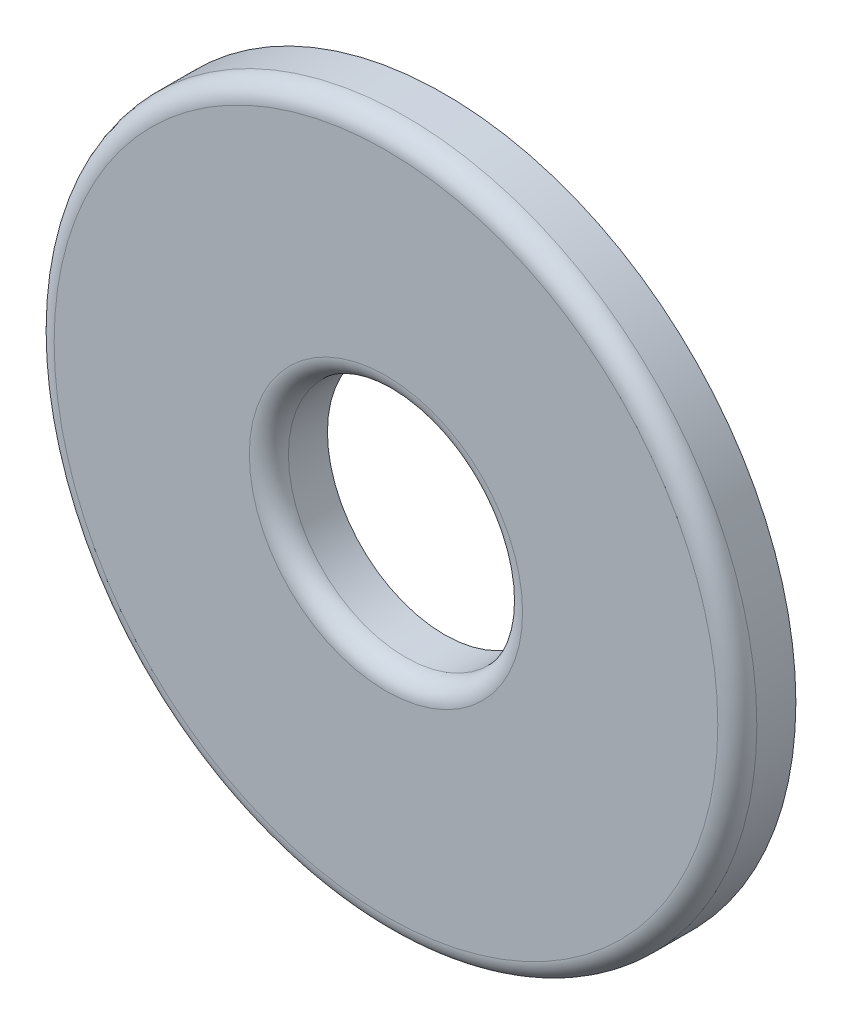
ISO-10303-21;
HEADER;
FILE_DESCRIPTION(('STEP AP214'),'2;1');
FILE_NAME('part.step','',(''),(''),'','','');
FILE_SCHEMA(('AUTOMOTIVE_DESIGN { 1 0 10303 214 1 1 1 1 }'));
ENDSEC;
DATA;
#1=APPLICATION_CONTEXT('core data for automotive mechanical design processes');
#2=APPLICATION_PROTOCOL_DEFINITION('international standard','automotive_design',2000,#1);
#3=PRODUCT_CONTEXT('',#1,'mechanical');
#4=PRODUCT('Part','Part','',(#3));
#5=PRODUCT_RELATED_PRODUCT_CATEGORY('part','',(#4));
#6=PRODUCT_DEFINITION_FORMATION('','',#4);
#7=PRODUCT_DEFINITION_CONTEXT('part definition',#1,'design');
#8=PRODUCT_DEFINITION('design','',#6,#7);
#9=PRODUCT_DEFINITION_SHAPE('','',#8);
#10=(LENGTH_UNIT() NAMED_UNIT(*) SI_UNIT(.MILLI.,.METRE.));
#11=(NAMED_UNIT(*) PLANE_ANGLE_UNIT() SI_UNIT($,.RADIAN.));
#12=(NAMED_UNIT(*) SI_UNIT($,.STERADIAN.) SOLID_ANGLE_UNIT());
#13=UNCERTAINTY_MEASURE_WITH_UNIT(LENGTH_MEASURE(1.E-05),#10,'distance_accuracy_value','');
#14=(GEOMETRIC_REPRESENTATION_CONTEXT(3) GLOBAL_UNCERTAINTY_ASSIGNED_CONTEXT((#13)) GLOBAL_UNIT_ASSIGNED_CONTEXT((#10,
#11,#12)) REPRESENTATION_CONTEXT('',''));
#15=CARTESIAN_POINT('',(0.,0.,0.));
#16=DIRECTION('',(0.,0.,1.));
#17=DIRECTION('',(1.,0.,0.));
#18=AXIS2_PLACEMENT_3D('',#15,#16,#17);
#19=CARTESIAN_POINT('',(0.,0.,0.75));
#20=DIRECTION('',(0.,0.,1.));
#21=DIRECTION('',(1.,0.,0.));
#22=AXIS2_PLACEMENT_3D('',#19,#20,#21);
#23=PLANE('',#22);
#24=CARTESIAN_POINT('',(0.,0.,0.75));
#25=DIRECTION('',(0.,0.,1.));
#26=DIRECTION('',(1.,0.,0.));
#27=AXIS2_PLACEMENT_3D('',#24,#25,#26);
#28=CIRCLE('',#27,1.75);
#29=CARTESIAN_POINT('',(1.75,0.,0.75));
#30=VERTEX_POINT('',#29);
#31=EDGE_CURVE('E47',#30,#30,#28,.F.);
#32=ORIENTED_EDGE('',*,*,#31,.T.);
#33=EDGE_LOOP('',(#32));
#34=FACE_BOUND('',#33,.T.);
#35=CARTESIAN_POINT('',(0.,0.,0.75));
#36=DIRECTION('',(0.,0.,1.));
#37=DIRECTION('',(1.,0.,0.));
#38=AXIS2_PLACEMENT_3D('',#35,#36,#37);
#39=CIRCLE('',#38,4.25);
#40=CARTESIAN_POINT('',(4.25,0.,0.75));
#41=VERTEX_POINT('',#40);
#42=EDGE_CURVE('E52',#41,#41,#39,.T.);
#43=ORIENTED_EDGE('',*,*,#42,.T.);
#44=EDGE_LOOP('',(#43));
#45=FACE_BOUND('',#44,.T.);
#46=ADVANCED_FACE('F39',(#34,#45),#23,.T.);
#47=CARTESIAN_POINT('',(0.,0.,0.));
#48=DIRECTION('',(0.,0.,1.));
#49=DIRECTION('',(1.,0.,0.));
#50=AXIS2_PLACEMENT_3D('',#47,#48,#49);
#51=PLANE('',#50);
#52=CARTESIAN_POINT('',(0.,0.,0.));
#53=DIRECTION('',(0.,0.,1.));
#54=DIRECTION('',(1.,0.,0.));
#55=AXIS2_PLACEMENT_3D('',#52,#53,#54);
#56=CIRCLE('',#55,4.5);
#57=CARTESIAN_POINT('',(4.5,0.,0.));
#58=VERTEX_POINT('',#57);
#59=EDGE_CURVE('E63',#58,#58,#56,.T.);
#60=ORIENTED_EDGE('',*,*,#59,.F.);
#61=EDGE_LOOP('',(#60));
#62=FACE_BOUND('',#61,.T.);
#63=CARTESIAN_POINT('',(0.,0.,0.));
#64=DIRECTION('',(0.,0.,1.));
#65=DIRECTION('',(1.,0.,0.));
#66=AXIS2_PLACEMENT_3D('',#63,#64,#65);
#67=CIRCLE('',#66,1.5);
#68=CARTESIAN_POINT('',(1.5,0.,0.));
#69=VERTEX_POINT('',#68);
#70=EDGE_CURVE('E67',#69,#69,#67,.T.);
#71=ORIENTED_EDGE('',*,*,#70,.T.);
#72=EDGE_LOOP('',(#71));
#73=FACE_BOUND('',#72,.T.);
#74=ADVANCED_FACE('F72',(#62,#73),#51,.F.);
#75=CARTESIAN_POINT('',(0.,0.,0.75));
#76=DIRECTION('',(0.,0.,-1.));
#77=DIRECTION('',(-1.,0.,0.));
#78=AXIS2_PLACEMENT_3D('',#75,#76,#77);
#79=CYLINDRICAL_SURFACE('',#78,4.5);
#80=CARTESIAN_POINT('',(0.,0.,0.5));
#81=DIRECTION('',(0.,0.,1.));
#82=DIRECTION('',(1.,0.,0.));
#83=AXIS2_PLACEMENT_3D('',#80,#81,#82);
#84=CIRCLE('',#83,4.5);
#85=CARTESIAN_POINT('',(4.5,0.,0.5));
#86=VERTEX_POINT('',#85);
#87=EDGE_CURVE('E10',#86,#86,#84,.F.);
#88=ORIENTED_EDGE('',*,*,#87,.T.);
#89=EDGE_LOOP('',(#88));
#90=FACE_BOUND('',#89,.T.);
#91=ORIENTED_EDGE('',*,*,#59,.T.);
#92=EDGE_LOOP('',(#91));
#93=FACE_BOUND('',#92,.T.);
#94=ADVANCED_FACE('F77',(#90,#93),#79,.T.);
#95=CARTESIAN_POINT('',(0.,0.,0.75));
#96=DIRECTION('',(0.,0.,-1.));
#97=DIRECTION('',(-1.,0.,0.));
#98=AXIS2_PLACEMENT_3D('',#95,#96,#97);
#99=CYLINDRICAL_SURFACE('',#98,1.5);
#100=CARTESIAN_POINT('',(0.,0.,0.5));
#101=DIRECTION('',(0.,0.,1.));
#102=DIRECTION('',(1.,0.,0.));
#103=AXIS2_PLACEMENT_3D('',#100,#101,#102);
#104=CIRCLE('',#103,1.5);
#105=CARTESIAN_POINT('',(1.5,0.,0.5));
#106=VERTEX_POINT('',#105);
#107=EDGE_CURVE('E57',#106,#106,#104,.T.);
#108=ORIENTED_EDGE('',*,*,#107,.T.);
#109=EDGE_LOOP('',(#108));
#110=FACE_BOUND('',#109,.T.);
#111=ORIENTED_EDGE('',*,*,#70,.F.);
#112=EDGE_LOOP('',(#111));
#113=FACE_BOUND('',#112,.T.);
#114=ADVANCED_FACE('F74',(#110,#113),#99,.F.);
#115=CARTESIAN_POINT('',(0.,0.,0.5));
#116=DIRECTION('',(0.,0.,1.));
#117=DIRECTION('',(1.,0.,0.));
#118=AXIS2_PLACEMENT_3D('',#115,#116,#117);
#119=TOROIDAL_SURFACE('',#118,1.75,0.25);
#120=ORIENTED_EDGE('',*,*,#31,.F.);
#121=EDGE_LOOP('',(#120));
#122=FACE_BOUND('',#121,.T.);
#123=ORIENTED_EDGE('',*,*,#107,.F.);
#124=EDGE_LOOP('',(#123));
#125=FACE_BOUND('',#124,.T.);
#126=ADVANCED_FACE('F76',(#122,#125),#119,.T.);
#127=CARTESIAN_POINT('',(0.,0.,0.5));
#128=DIRECTION('',(0.,0.,1.));
#129=DIRECTION('',(1.,0.,0.));
#130=AXIS2_PLACEMENT_3D('',#127,#128,#129);
#131=TOROIDAL_SURFACE('',#130,4.25,0.25);
#132=ORIENTED_EDGE('',*,*,#87,.F.);
#133=EDGE_LOOP('',(#132));
#134=FACE_BOUND('',#133,.T.);
#135=ORIENTED_EDGE('',*,*,#42,.F.);
#136=EDGE_LOOP('',(#135));
#137=FACE_BOUND('',#136,.T.);
#138=ADVANCED_FACE('F41',(#134,#137),#131,.T.);
#139=CLOSED_SHELL('',(#46,#74,#94,#114,#126,#138));
#140=MANIFOLD_SOLID_BREP('B2',#139);
#141=ADVANCED_BREP_SHAPE_REPRESENTATION('',(#18,#140),#14);
#142=SHAPE_DEFINITION_REPRESENTATION(#9,#141);
ENDSEC;
END-ISO-10303-21;
